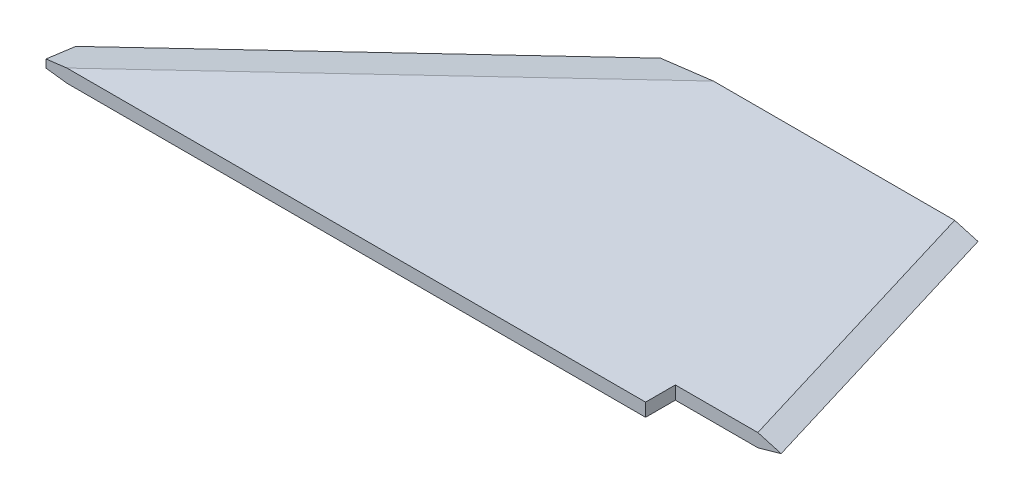
ISO-10303-21;
HEADER;
FILE_DESCRIPTION(('STEP AP214'),'2;1');
FILE_NAME('part.step','',(''),(''),'','','');
FILE_SCHEMA(('AUTOMOTIVE_DESIGN { 1 0 10303 214 1 1 1 1 }'));
ENDSEC;
DATA;
#1=APPLICATION_CONTEXT('core data for automotive mechanical design processes');
#2=APPLICATION_PROTOCOL_DEFINITION('international standard','automotive_design',2000,#1);
#3=PRODUCT_CONTEXT('',#1,'mechanical');
#4=PRODUCT('Part','Part','',(#3));
#5=PRODUCT_RELATED_PRODUCT_CATEGORY('part','',(#4));
#6=PRODUCT_DEFINITION_FORMATION('','',#4);
#7=PRODUCT_DEFINITION_CONTEXT('part definition',#1,'design');
#8=PRODUCT_DEFINITION('design','',#6,#7);
#9=PRODUCT_DEFINITION_SHAPE('','',#8);
#10=(LENGTH_UNIT() NAMED_UNIT(*) SI_UNIT(.MILLI.,.METRE.));
#11=(NAMED_UNIT(*) PLANE_ANGLE_UNIT() SI_UNIT($,.RADIAN.));
#12=(NAMED_UNIT(*) SI_UNIT($,.STERADIAN.) SOLID_ANGLE_UNIT());
#13=UNCERTAINTY_MEASURE_WITH_UNIT(LENGTH_MEASURE(1.E-05),#10,'distance_accuracy_value','');
#14=(GEOMETRIC_REPRESENTATION_CONTEXT(3) GLOBAL_UNCERTAINTY_ASSIGNED_CONTEXT((#13)) GLOBAL_UNIT_ASSIGNED_CONTEXT((#10,
#11,#12)) REPRESENTATION_CONTEXT('',''));
#15=CARTESIAN_POINT('',(0.,0.,0.));
#16=DIRECTION('',(0.,0.,1.));
#17=DIRECTION('',(1.,0.,0.));
#18=AXIS2_PLACEMENT_3D('',#15,#16,#17);
#19=CARTESIAN_POINT('',(108.966,4.7498,-101.612438876076));
#20=DIRECTION('',(0.,0.,-1.));
#21=DIRECTION('',(-1.,0.,0.));
#22=AXIS2_PLACEMENT_3D('',#19,#20,#21);
#23=PLANE('',#22);
#24=DIRECTION('',(-0.992319310282372,-0.123702815007248,0.));
#25=VECTOR('',#24,1.);
#26=CARTESIAN_POINT('',(109.257525368392,2.41124163755806,-101.612438876076));
#27=LINE('',#26,#25);
#28=CARTESIAN_POINT('',(128.016974141951,4.7498,-101.612438876076));
#29=VERTEX_POINT('',#28);
#30=CARTESIAN_POINT('',(108.966,2.3749,-101.612438876076));
#31=VERTEX_POINT('',#30);
#32=EDGE_CURVE('E156',#29,#31,#27,.T.);
#33=ORIENTED_EDGE('',*,*,#32,.F.);
#34=DIRECTION('',(1.,0.,0.));
#35=VECTOR('',#34,1.);
#36=CARTESIAN_POINT('',(108.966,4.7498,-101.612438876076));
#37=LINE('',#36,#35);
#38=CARTESIAN_POINT('',(214.867830163761,4.7498,-101.612438876076));
#39=VERTEX_POINT('',#38);
#40=EDGE_CURVE('E178',#29,#39,#37,.T.);
#41=ORIENTED_EDGE('',*,*,#40,.T.);
#42=DIRECTION('',(0.962264284989572,-0.272116603377132,0.));
#43=VECTOR('',#42,1.);
#44=CARTESIAN_POINT('',(116.80776003272,32.4799918269483,-101.612438876076));
#45=LINE('',#44,#43);
#46=CARTESIAN_POINT('',(223.266,2.3749,-101.612438876076));
#47=VERTEX_POINT('',#46);
#48=EDGE_CURVE('E210',#39,#47,#45,.T.);
#49=ORIENTED_EDGE('',*,*,#48,.T.);
#50=DIRECTION('',(-0.962264284989572,-0.272116603377132,0.));
#51=VECTOR('',#50,1.);
#52=CARTESIAN_POINT('',(118.051486084819,-27.3784812687283,-101.612438876076));
#53=LINE('',#52,#51);
#54=CARTESIAN_POINT('',(214.867830163761,0.,-101.612438876076));
#55=VERTEX_POINT('',#54);
#56=EDGE_CURVE('E204',#47,#55,#53,.T.);
#57=ORIENTED_EDGE('',*,*,#56,.T.);
#58=DIRECTION('',(1.,0.,0.));
#59=VECTOR('',#58,1.);
#60=CARTESIAN_POINT('',(108.966,0.,-101.612438876076));
#61=LINE('',#60,#59);
#62=CARTESIAN_POINT('',(128.016974141951,0.,-101.612438876076));
#63=VERTEX_POINT('',#62);
#64=EDGE_CURVE('E191',#63,#55,#61,.T.);
#65=ORIENTED_EDGE('',*,*,#64,.F.);
#66=DIRECTION('',(0.992319310282372,-0.123702815007248,0.));
#67=VECTOR('',#66,1.);
#68=CARTESIAN_POINT('',(108.674474631608,2.41124163755806,-101.612438876076));
#69=LINE('',#68,#67);
#70=EDGE_CURVE('E157',#31,#63,#69,.T.);
#71=ORIENTED_EDGE('',*,*,#70,.F.);
#72=EDGE_LOOP('',(#33,#41,#49,#57,#65,#71));
#73=FACE_BOUND('',#72,.T.);
#74=ADVANCED_FACE('F69',(#73),#23,.T.);
#75=CARTESIAN_POINT('',(0.,0.,0.));
#76=DIRECTION('',(0.,-1.,0.));
#77=DIRECTION('',(0.,0.,-1.));
#78=AXIS2_PLACEMENT_3D('',#75,#76,#77);
#79=PLANE('',#78);
#80=DIRECTION('',(-0.731353701619172,0.,0.681998360062497));
#81=VECTOR('',#80,1.);
#82=CARTESIAN_POINT('',(195.402552888712,0.,-164.450507645548));
#83=LINE('',#82,#81);
#84=CARTESIAN_POINT('',(7.55646841293814,0.,10.7188));
#85=VERTEX_POINT('',#84);
#86=EDGE_CURVE('E237',#63,#85,#83,.T.);
#87=ORIENTED_EDGE('',*,*,#86,.F.);
#88=ORIENTED_EDGE('',*,*,#64,.T.);
#89=DIRECTION('',(0.289509990426842,0.,0.957174992069397));
#90=VECTOR('',#89,1.);
#91=CARTESIAN_POINT('',(209.537962672761,0.,-119.233992681203));
#92=LINE('',#91,#90);
#93=CARTESIAN_POINT('',(245.601830163761,0.,0.));
#94=VERTEX_POINT('',#93);
#95=EDGE_CURVE('E216',#55,#94,#92,.T.);
#96=ORIENTED_EDGE('',*,*,#95,.T.);
#97=DIRECTION('',(1.,0.,0.));
#98=VECTOR('',#97,1.);
#99=CARTESIAN_POINT('',(0.,0.,0.));
#100=LINE('',#99,#98);
#101=CARTESIAN_POINT('',(215.9,0.,0.));
#102=VERTEX_POINT('',#101);
#103=EDGE_CURVE('E167',#102,#94,#100,.T.);
#104=ORIENTED_EDGE('',*,*,#103,.F.);
#105=DIRECTION('',(0.,0.,1.));
#106=VECTOR('',#105,1.);
#107=CARTESIAN_POINT('',(215.9,0.,0.));
#108=LINE('',#107,#106);
#109=CARTESIAN_POINT('',(215.9,0.,10.7188));
#110=VERTEX_POINT('',#109);
#111=EDGE_CURVE('E173',#102,#110,#108,.T.);
#112=ORIENTED_EDGE('',*,*,#111,.T.);
#113=DIRECTION('',(1.,0.,0.));
#114=VECTOR('',#113,1.);
#115=CARTESIAN_POINT('',(0.,0.,10.7188));
#116=LINE('',#115,#114);
#117=EDGE_CURVE('E202',#85,#110,#116,.T.);
#118=ORIENTED_EDGE('',*,*,#117,.F.);
#119=EDGE_LOOP('',(#87,#88,#96,#104,#112,#118));
#120=FACE_BOUND('',#119,.T.);
#121=ADVANCED_FACE('F245',(#120),#79,.T.);
#122=CARTESIAN_POINT('',(0.,4.7498,0.));
#123=DIRECTION('',(0.,-1.,0.));
#124=DIRECTION('',(0.,0.,-1.));
#125=AXIS2_PLACEMENT_3D('',#122,#123,#124);
#126=PLANE('',#125);
#127=ORIENTED_EDGE('',*,*,#40,.F.);
#128=DIRECTION('',(-0.731353701619172,0.,0.681998360062497));
#129=VECTOR('',#128,1.);
#130=CARTESIAN_POINT('',(195.402552888712,4.7498,-164.450507645548));
#131=LINE('',#130,#129);
#132=CARTESIAN_POINT('',(7.55646841293811,4.74979999999999,10.7188));
#133=VERTEX_POINT('',#132);
#134=EDGE_CURVE('E234',#29,#133,#131,.T.);
#135=ORIENTED_EDGE('',*,*,#134,.T.);
#136=DIRECTION('',(1.,0.,0.));
#137=VECTOR('',#136,1.);
#138=CARTESIAN_POINT('',(0.,4.7498,10.7188));
#139=LINE('',#138,#137);
#140=CARTESIAN_POINT('',(215.9,4.7498,10.7188));
#141=VERTEX_POINT('',#140);
#142=EDGE_CURVE('E154',#133,#141,#139,.T.);
#143=ORIENTED_EDGE('',*,*,#142,.T.);
#144=DIRECTION('',(0.,0.,1.));
#145=VECTOR('',#144,1.);
#146=CARTESIAN_POINT('',(215.9,4.7498,0.));
#147=LINE('',#146,#145);
#148=CARTESIAN_POINT('',(215.9,4.7498,0.));
#149=VERTEX_POINT('',#148);
#150=EDGE_CURVE('E162',#149,#141,#147,.T.);
#151=ORIENTED_EDGE('',*,*,#150,.F.);
#152=DIRECTION('',(1.,0.,0.));
#153=VECTOR('',#152,1.);
#154=CARTESIAN_POINT('',(0.,4.7498,0.));
#155=LINE('',#154,#153);
#156=CARTESIAN_POINT('',(245.601830163761,4.74979999999999,0.));
#157=VERTEX_POINT('',#156);
#158=EDGE_CURVE('E187',#149,#157,#155,.T.);
#159=ORIENTED_EDGE('',*,*,#158,.T.);
#160=DIRECTION('',(0.289509990426842,0.,0.957174992069397));
#161=VECTOR('',#160,1.);
#162=CARTESIAN_POINT('',(209.537962672761,4.7498,-119.233992681203));
#163=LINE('',#162,#161);
#164=EDGE_CURVE('E93',#39,#157,#163,.T.);
#165=ORIENTED_EDGE('',*,*,#164,.F.);
#166=EDGE_LOOP('',(#127,#135,#143,#151,#159,#165));
#167=FACE_BOUND('',#166,.T.);
#168=ADVANCED_FACE('F253',(#167),#126,.F.);
#169=CARTESIAN_POINT('',(0.,4.7498,0.));
#170=DIRECTION('',(0.,0.,-1.));
#171=DIRECTION('',(-1.,0.,0.));
#172=AXIS2_PLACEMENT_3D('',#169,#170,#171);
#173=PLANE('',#172);
#174=DIRECTION('',(-0.962264284989572,-0.272116603377132,0.));
#175=VECTOR('',#174,1.);
#176=CARTESIAN_POINT('',(19.4299142677605,-63.9586592716418,0.));
#177=LINE('',#176,#175);
#178=CARTESIAN_POINT('',(254.,2.3749,0.));
#179=VERTEX_POINT('',#178);
#180=EDGE_CURVE('E182',#179,#94,#177,.T.);
#181=ORIENTED_EDGE('',*,*,#180,.F.);
#182=DIRECTION('',(0.962264284989572,-0.272116603377132,0.));
#183=VECTOR('',#182,1.);
#184=CARTESIAN_POINT('',(18.1861882156614,69.0601698298617,0.));
#185=LINE('',#184,#183);
#186=EDGE_CURVE('E177',#157,#179,#185,.T.);
#187=ORIENTED_EDGE('',*,*,#186,.F.);
#188=ORIENTED_EDGE('',*,*,#158,.F.);
#189=DIRECTION('',(0.,-1.,0.));
#190=VECTOR('',#189,1.);
#191=CARTESIAN_POINT('',(215.9,4.7498,0.));
#192=LINE('',#191,#190);
#193=EDGE_CURVE('E175',#149,#102,#192,.T.);
#194=ORIENTED_EDGE('',*,*,#193,.T.);
#195=ORIENTED_EDGE('',*,*,#103,.T.);
#196=EDGE_LOOP('',(#181,#187,#188,#194,#195));
#197=FACE_BOUND('',#196,.T.);
#198=ADVANCED_FACE('F254',(#197),#173,.F.);
#199=CARTESIAN_POINT('',(0.,4.7498,10.7188));
#200=DIRECTION('',(0.,0.,-1.));
#201=DIRECTION('',(-1.,0.,0.));
#202=AXIS2_PLACEMENT_3D('',#199,#200,#201);
#203=PLANE('',#202);
#204=ORIENTED_EDGE('',*,*,#142,.F.);
#205=DIRECTION('',(-0.992319310282372,-0.123702815007248,0.));
#206=VECTOR('',#205,1.);
#207=CARTESIAN_POINT('',(0.115631999781857,3.82222315978517,10.7188));
#208=LINE('',#207,#206);
#209=CARTESIAN_POINT('',(0.,3.80780844092433,10.7188000000001));
#210=VERTEX_POINT('',#209);
#211=EDGE_CURVE('E143',#133,#210,#208,.T.);
#212=ORIENTED_EDGE('',*,*,#211,.T.);
#213=DIRECTION('',(0.,-1.,0.));
#214=VECTOR('',#213,1.);
#215=CARTESIAN_POINT('',(0.,4.7498,10.7188));
#216=LINE('',#215,#214);
#217=CARTESIAN_POINT('',(0.,0.94199155907567,10.7188));
#218=VERTEX_POINT('',#217);
#219=EDGE_CURVE('E152',#210,#218,#216,.T.);
#220=ORIENTED_EDGE('',*,*,#219,.T.);
#221=DIRECTION('',(0.992319310282372,-0.123702815007248,0.));
#222=VECTOR('',#221,1.);
#223=CARTESIAN_POINT('',(-0.467418737002636,1.00026011533094,10.7188));
#224=LINE('',#223,#222);
#225=EDGE_CURVE('E85',#218,#85,#224,.T.);
#226=ORIENTED_EDGE('',*,*,#225,.T.);
#227=ORIENTED_EDGE('',*,*,#117,.T.);
#228=DIRECTION('',(0.,-1.,0.));
#229=VECTOR('',#228,1.);
#230=CARTESIAN_POINT('',(215.9,4.7498,10.7188));
#231=LINE('',#230,#229);
#232=EDGE_CURVE('E161',#141,#110,#231,.T.);
#233=ORIENTED_EDGE('',*,*,#232,.F.);
#234=EDGE_LOOP('',(#204,#212,#220,#226,#227,#233));
#235=FACE_BOUND('',#234,.T.);
#236=ADVANCED_FACE('F71',(#235),#203,.F.);
#237=CARTESIAN_POINT('',(215.9,4.7498,0.));
#238=DIRECTION('',(1.,0.,0.));
#239=DIRECTION('',(0.,0.,-1.));
#240=AXIS2_PLACEMENT_3D('',#237,#238,#239);
#241=PLANE('',#240);
#242=ORIENTED_EDGE('',*,*,#111,.F.);
#243=ORIENTED_EDGE('',*,*,#193,.F.);
#244=ORIENTED_EDGE('',*,*,#150,.T.);
#245=ORIENTED_EDGE('',*,*,#232,.T.);
#246=EDGE_LOOP('',(#242,#243,#244,#245));
#247=FACE_BOUND('',#246,.T.);
#248=ADVANCED_FACE('F248',(#247),#241,.T.);
#249=CARTESIAN_POINT('',(0.,4.7498,0.));
#250=DIRECTION('',(1.,0.,0.));
#251=DIRECTION('',(0.,0.,-1.));
#252=AXIS2_PLACEMENT_3D('',#249,#250,#251);
#253=PLANE('',#252);
#254=ORIENTED_EDGE('',*,*,#219,.F.);
#255=DIRECTION('',(0.,-0.132503070001756,-0.991182594903739));
#256=VECTOR('',#255,1.);
#257=CARTESIAN_POINT('',(0.,2.41659627024837,0.311906866324326));
#258=LINE('',#257,#256);
#259=CARTESIAN_POINT('',(0.,2.3749,0.));
#260=VERTEX_POINT('',#259);
#261=EDGE_CURVE('E12',#210,#260,#258,.T.);
#262=ORIENTED_EDGE('',*,*,#261,.T.);
#263=DIRECTION('',(0.,-0.132503070001756,0.991182594903739));
#264=VECTOR('',#263,1.);
#265=CARTESIAN_POINT('',(0.,2.41659627024839,-0.311906866324324));
#266=LINE('',#265,#264);
#267=EDGE_CURVE('E78',#260,#218,#266,.T.);
#268=ORIENTED_EDGE('',*,*,#267,.T.);
#269=EDGE_LOOP('',(#254,#262,#268));
#270=FACE_BOUND('',#269,.T.);
#271=ADVANCED_FACE('F159',(#270),#253,.F.);
#272=CARTESIAN_POINT('',(209.537962672761,0.,-119.233992681203));
#273=DIRECTION('',(0.27119958108633,-0.959021492054386,-0.082027830620939));
#274=DIRECTION('',(0.962264284989572,0.272116603377132,0.));
#275=AXIS2_PLACEMENT_3D('',#272,#273,#274);
#276=PLANE('',#275);
#277=DIRECTION('',(0.289509990426842,0.,0.957174992069397));
#278=VECTOR('',#277,1.);
#279=CARTESIAN_POINT('',(217.232231215791,2.3749,-121.561223992813));
#280=LINE('',#279,#278);
#281=EDGE_CURVE('E222',#47,#179,#280,.T.);
#282=ORIENTED_EDGE('',*,*,#281,.T.);
#283=ORIENTED_EDGE('',*,*,#180,.T.);
#284=ORIENTED_EDGE('',*,*,#95,.F.);
#285=ORIENTED_EDGE('',*,*,#56,.F.);
#286=EDGE_LOOP('',(#282,#283,#284,#285));
#287=FACE_BOUND('',#286,.T.);
#288=ADVANCED_FACE('F258',(#287),#276,.T.);
#289=CARTESIAN_POINT('',(217.232231215791,2.3749,-121.561223992813));
#290=DIRECTION('',(0.27119958108633,0.959021492054386,-0.082027830620939));
#291=DIRECTION('',(-0.962264284989572,0.272116603377132,0.));
#292=AXIS2_PLACEMENT_3D('',#289,#290,#291);
#293=PLANE('',#292);
#294=ORIENTED_EDGE('',*,*,#164,.T.);
#295=ORIENTED_EDGE('',*,*,#186,.T.);
#296=ORIENTED_EDGE('',*,*,#281,.F.);
#297=ORIENTED_EDGE('',*,*,#48,.F.);
#298=EDGE_LOOP('',(#294,#295,#296,#297));
#299=FACE_BOUND('',#298,.T.);
#300=ADVANCED_FACE('F256',(#299),#293,.T.);
#301=CARTESIAN_POINT('',(195.402552888712,4.7498,-164.450507645548));
#302=DIRECTION('',(0.122628551280468,-0.983701780920916,0.131503021348832));
#303=DIRECTION('',(0.,-0.132503070001756,-0.991182594903739));
#304=AXIS2_PLACEMENT_3D('',#301,#302,#303);
#305=PLANE('',#304);
#306=ORIENTED_EDGE('',*,*,#32,.T.);
#307=DIRECTION('',(-0.731353701619172,0.,0.681998360062497));
#308=VECTOR('',#307,1.);
#309=CARTESIAN_POINT('',(186.541530206503,2.3749,-173.952791108768));
#310=LINE('',#309,#308);
#311=EDGE_CURVE('E146',#31,#260,#310,.T.);
#312=ORIENTED_EDGE('',*,*,#311,.T.);
#313=ORIENTED_EDGE('',*,*,#261,.F.);
#314=ORIENTED_EDGE('',*,*,#211,.F.);
#315=ORIENTED_EDGE('',*,*,#134,.F.);
#316=EDGE_LOOP('',(#306,#312,#313,#314,#315));
#317=FACE_BOUND('',#316,.T.);
#318=ADVANCED_FACE('F142',(#317),#305,.F.);
#319=CARTESIAN_POINT('',(186.541530206503,2.3749,-173.952791108768));
#320=DIRECTION('',(0.122628551280468,0.983701780920916,0.131503021348832));
#321=DIRECTION('',(0.,-0.132503070001756,0.991182594903739));
#322=AXIS2_PLACEMENT_3D('',#319,#320,#321);
#323=PLANE('',#322);
#324=ORIENTED_EDGE('',*,*,#70,.T.);
#325=ORIENTED_EDGE('',*,*,#86,.T.);
#326=ORIENTED_EDGE('',*,*,#225,.F.);
#327=ORIENTED_EDGE('',*,*,#267,.F.);
#328=ORIENTED_EDGE('',*,*,#311,.F.);
#329=EDGE_LOOP('',(#324,#325,#326,#327,#328));
#330=FACE_BOUND('',#329,.T.);
#331=ADVANCED_FACE('F242',(#330),#323,.F.);
#332=CLOSED_SHELL('',(#74,#121,#168,#198,#236,#248,#271,#288,#300,#318,#331));
#333=MANIFOLD_SOLID_BREP('B2',#332);
#334=ADVANCED_BREP_SHAPE_REPRESENTATION('',(#18,#333),#14);
#335=SHAPE_DEFINITION_REPRESENTATION(#9,#334);
ENDSEC;
END-ISO-10303-21;
